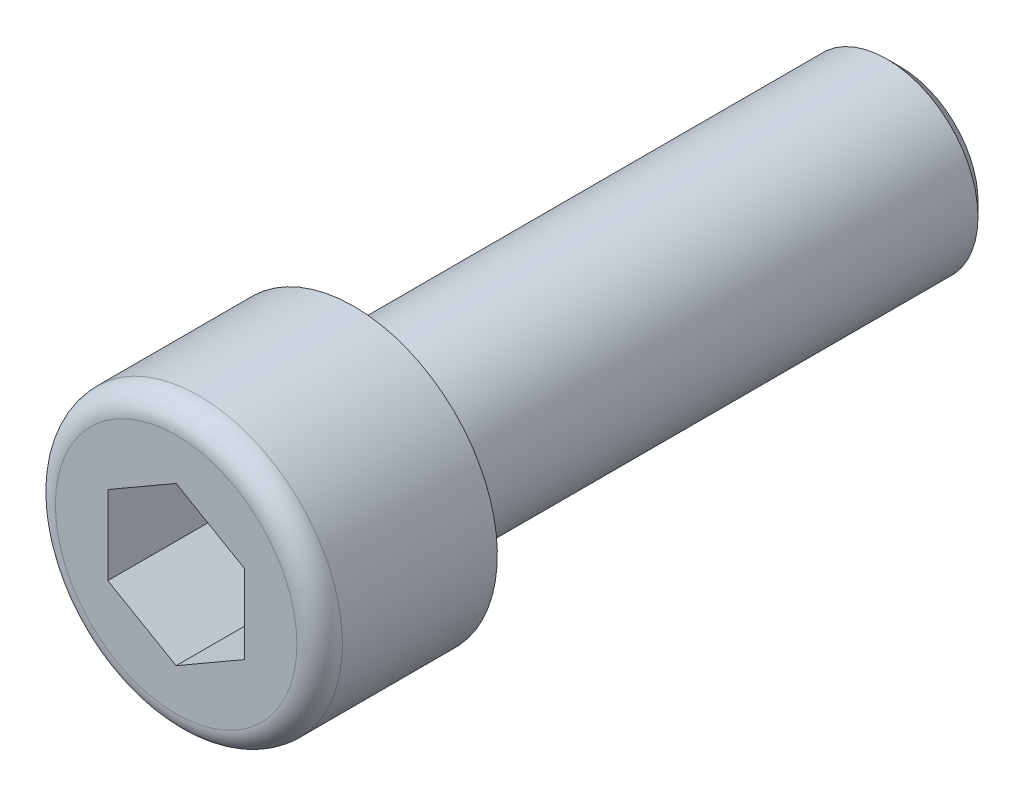
ISO-10303-21;
HEADER;
FILE_DESCRIPTION(('STEP AP214'),'2;1');
FILE_NAME('part.step','',(''),(''),'','','');
FILE_SCHEMA(('AUTOMOTIVE_DESIGN { 1 0 10303 214 1 1 1 1 }'));
ENDSEC;
DATA;
#1=APPLICATION_CONTEXT('core data for automotive mechanical design processes');
#2=APPLICATION_PROTOCOL_DEFINITION('international standard','automotive_design',2000,#1);
#3=PRODUCT_CONTEXT('',#1,'mechanical');
#4=PRODUCT('Part','Part','',(#3));
#5=PRODUCT_RELATED_PRODUCT_CATEGORY('part','',(#4));
#6=PRODUCT_DEFINITION_FORMATION('','',#4);
#7=PRODUCT_DEFINITION_CONTEXT('part definition',#1,'design');
#8=PRODUCT_DEFINITION('design','',#6,#7);
#9=PRODUCT_DEFINITION_SHAPE('','',#8);
#10=(LENGTH_UNIT() NAMED_UNIT(*) SI_UNIT(.MILLI.,.METRE.));
#11=(NAMED_UNIT(*) PLANE_ANGLE_UNIT() SI_UNIT($,.RADIAN.));
#12=(NAMED_UNIT(*) SI_UNIT($,.STERADIAN.) SOLID_ANGLE_UNIT());
#13=UNCERTAINTY_MEASURE_WITH_UNIT(LENGTH_MEASURE(1.E-05),#10,'distance_accuracy_value','');
#14=(GEOMETRIC_REPRESENTATION_CONTEXT(3) GLOBAL_UNCERTAINTY_ASSIGNED_CONTEXT((#13)) GLOBAL_UNIT_ASSIGNED_CONTEXT((#10,
#11,#12)) REPRESENTATION_CONTEXT('',''));
#15=CARTESIAN_POINT('',(0.,0.,0.));
#16=DIRECTION('',(0.,0.,1.));
#17=DIRECTION('',(1.,0.,0.));
#18=AXIS2_PLACEMENT_3D('',#15,#16,#17);
#19=CARTESIAN_POINT('',(0.,0.,7.95));
#20=DIRECTION('',(0.,0.,1.));
#21=DIRECTION('',(0.,-1.,0.));
#22=AXIS2_PLACEMENT_3D('',#19,#20,#21);
#23=PLANE('',#22);
#24=CARTESIAN_POINT('',(0.,0.,7.95));
#25=DIRECTION('',(0.,0.,1.));
#26=DIRECTION('',(0.,-1.,0.));
#27=AXIS2_PLACEMENT_3D('',#24,#25,#26);
#28=CIRCLE('',#27,2.65);
#29=CARTESIAN_POINT('',(0.,-2.65000000000001,7.95));
#30=VERTEX_POINT('',#29);
#31=EDGE_CURVE('E152',#30,#30,#28,.T.);
#32=ORIENTED_EDGE('',*,*,#31,.T.);
#33=EDGE_LOOP('',(#32));
#34=FACE_BOUND('',#33,.T.);
#35=DIRECTION('',(-0.866025403784438,0.5,0.));
#36=VECTOR('',#35,1.);
#37=CARTESIAN_POINT('',(1.5,0.866025403784439,7.95));
#38=LINE('',#37,#36);
#39=CARTESIAN_POINT('',(1.5,0.866025403784439,7.95));
#40=VERTEX_POINT('',#39);
#41=CARTESIAN_POINT('',(0.,1.73205080756888,7.95));
#42=VERTEX_POINT('',#41);
#43=EDGE_CURVE('E51',#40,#42,#38,.T.);
#44=ORIENTED_EDGE('',*,*,#43,.F.);
#45=DIRECTION('',(0.,1.,0.));
#46=VECTOR('',#45,1.);
#47=CARTESIAN_POINT('',(1.5,-0.866025403784439,7.95));
#48=LINE('',#47,#46);
#49=CARTESIAN_POINT('',(1.5,-0.866025403784439,7.95));
#50=VERTEX_POINT('',#49);
#51=EDGE_CURVE('E134',#50,#40,#48,.T.);
#52=ORIENTED_EDGE('',*,*,#51,.F.);
#53=DIRECTION('',(0.866025403784439,0.5,0.));
#54=VECTOR('',#53,1.);
#55=CARTESIAN_POINT('',(0.,-1.73205080756888,7.95));
#56=LINE('',#55,#54);
#57=CARTESIAN_POINT('',(0.,-1.73205080756888,7.95));
#58=VERTEX_POINT('',#57);
#59=EDGE_CURVE('E132',#58,#50,#56,.T.);
#60=ORIENTED_EDGE('',*,*,#59,.F.);
#61=DIRECTION('',(0.866025403784439,-0.5,0.));
#62=VECTOR('',#61,1.);
#63=CARTESIAN_POINT('',(-1.5,-0.866025403784439,7.95));
#64=LINE('',#63,#62);
#65=CARTESIAN_POINT('',(-1.5,-0.866025403784439,7.95));
#66=VERTEX_POINT('',#65);
#67=EDGE_CURVE('E99',#66,#58,#64,.T.);
#68=ORIENTED_EDGE('',*,*,#67,.F.);
#69=DIRECTION('',(0.,-1.,0.));
#70=VECTOR('',#69,1.);
#71=CARTESIAN_POINT('',(-1.5,0.866025403784439,7.95));
#72=LINE('',#71,#70);
#73=CARTESIAN_POINT('',(-1.5,0.866025403784439,7.95));
#74=VERTEX_POINT('',#73);
#75=EDGE_CURVE('E128',#74,#66,#72,.T.);
#76=ORIENTED_EDGE('',*,*,#75,.F.);
#77=DIRECTION('',(-0.866025403784439,-0.5,0.));
#78=VECTOR('',#77,1.);
#79=CARTESIAN_POINT('',(0.,1.73205080756888,7.95));
#80=LINE('',#79,#78);
#81=EDGE_CURVE('E125',#42,#74,#80,.T.);
#82=ORIENTED_EDGE('',*,*,#81,.F.);
#83=EDGE_LOOP('',(#44,#52,#60,#68,#76,#82));
#84=FACE_BOUND('',#83,.T.);
#85=ADVANCED_FACE('F35',(#34,#84),#23,.T.);
#86=CARTESIAN_POINT('',(0.,0.,-7.95));
#87=DIRECTION('',(0.,0.,-1.));
#88=DIRECTION('',(0.,1.,0.));
#89=AXIS2_PLACEMENT_3D('',#86,#87,#88);
#90=CYLINDRICAL_SURFACE('',#89,3.15);
#91=CARTESIAN_POINT('',(0.,0.,7.45));
#92=DIRECTION('',(0.,0.,1.));
#93=DIRECTION('',(0.,-1.,0.));
#94=AXIS2_PLACEMENT_3D('',#91,#92,#93);
#95=CIRCLE('',#94,3.15);
#96=CARTESIAN_POINT('',(0.,-3.15000000000001,7.45));
#97=VERTEX_POINT('',#96);
#98=EDGE_CURVE('E149',#97,#97,#95,.F.);
#99=ORIENTED_EDGE('',*,*,#98,.T.);
#100=EDGE_LOOP('',(#99));
#101=FACE_BOUND('',#100,.T.);
#102=CARTESIAN_POINT('',(0.,0.,4.05));
#103=DIRECTION('',(0.,0.,-1.));
#104=DIRECTION('',(0.,1.,0.));
#105=AXIS2_PLACEMENT_3D('',#102,#103,#104);
#106=CIRCLE('',#105,3.15);
#107=CARTESIAN_POINT('',(0.,3.15,4.05));
#108=VERTEX_POINT('',#107);
#109=EDGE_CURVE('E146',#108,#108,#106,.T.);
#110=ORIENTED_EDGE('',*,*,#109,.F.);
#111=EDGE_LOOP('',(#110));
#112=FACE_BOUND('',#111,.T.);
#113=ADVANCED_FACE('F168',(#101,#112),#90,.T.);
#114=CARTESIAN_POINT('',(0.,3.15,4.05));
#115=DIRECTION('',(0.,0.,-1.));
#116=DIRECTION('',(0.,1.,0.));
#117=AXIS2_PLACEMENT_3D('',#114,#115,#116);
#118=PLANE('',#117);
#119=ORIENTED_EDGE('',*,*,#109,.T.);
#120=EDGE_LOOP('',(#119));
#121=FACE_BOUND('',#120,.T.);
#122=CARTESIAN_POINT('',(0.,0.,4.05));
#123=DIRECTION('',(0.,0.,-1.));
#124=DIRECTION('',(0.,1.,0.));
#125=AXIS2_PLACEMENT_3D('',#122,#123,#124);
#126=CIRCLE('',#125,2.);
#127=CARTESIAN_POINT('',(0.,2.,4.05));
#128=VERTEX_POINT('',#127);
#129=EDGE_CURVE('E138',#128,#128,#126,.T.);
#130=ORIENTED_EDGE('',*,*,#129,.F.);
#131=EDGE_LOOP('',(#130));
#132=FACE_BOUND('',#131,.T.);
#133=ADVANCED_FACE('F174',(#121,#132),#118,.T.);
#134=CARTESIAN_POINT('',(0.,0.,-7.95));
#135=DIRECTION('',(0.,0.,-1.));
#136=DIRECTION('',(0.,1.,0.));
#137=AXIS2_PLACEMENT_3D('',#134,#135,#136);
#138=CYLINDRICAL_SURFACE('',#137,2.);
#139=CARTESIAN_POINT('',(0.,0.,-7.65));
#140=DIRECTION('',(0.,0.,-1.));
#141=DIRECTION('',(0.,1.,0.));
#142=AXIS2_PLACEMENT_3D('',#139,#140,#141);
#143=CIRCLE('',#142,2.);
#144=CARTESIAN_POINT('',(0.,2.,-7.65));
#145=VERTEX_POINT('',#144);
#146=EDGE_CURVE('E11',#145,#145,#143,.F.);
#147=ORIENTED_EDGE('',*,*,#146,.T.);
#148=EDGE_LOOP('',(#147));
#149=FACE_BOUND('',#148,.T.);
#150=ORIENTED_EDGE('',*,*,#129,.T.);
#151=EDGE_LOOP('',(#150));
#152=FACE_BOUND('',#151,.T.);
#153=ADVANCED_FACE('F181',(#149,#152),#138,.T.);
#154=CARTESIAN_POINT('',(0.,2.,-7.95));
#155=DIRECTION('',(0.,0.,-1.));
#156=DIRECTION('',(0.,1.,0.));
#157=AXIS2_PLACEMENT_3D('',#154,#155,#156);
#158=PLANE('',#157);
#159=CARTESIAN_POINT('',(0.,0.,-7.95));
#160=DIRECTION('',(0.,0.,-1.));
#161=DIRECTION('',(0.,1.,0.));
#162=AXIS2_PLACEMENT_3D('',#159,#160,#161);
#163=CIRCLE('',#162,1.7);
#164=CARTESIAN_POINT('',(0.,1.7,-7.95));
#165=VERTEX_POINT('',#164);
#166=EDGE_CURVE('E44',#165,#165,#163,.T.);
#167=ORIENTED_EDGE('',*,*,#166,.T.);
#168=EDGE_LOOP('',(#167));
#169=FACE_BOUND('',#168,.T.);
#170=ADVANCED_FACE('F157',(#169),#158,.T.);
#171=CARTESIAN_POINT('',(1.5,0.866025403784439,5.45));
#172=DIRECTION('',(0.5,0.866025403784439,0.));
#173=DIRECTION('',(-0.866025403784439,0.5,0.));
#174=AXIS2_PLACEMENT_3D('',#171,#172,#173);
#175=PLANE('',#174);
#176=ORIENTED_EDGE('',*,*,#43,.T.);
#177=DIRECTION('',(0.,0.,1.));
#178=VECTOR('',#177,1.);
#179=CARTESIAN_POINT('',(0.,1.73205080756888,5.45));
#180=LINE('',#179,#178);
#181=CARTESIAN_POINT('',(0.,1.73205080756888,5.45));
#182=VERTEX_POINT('',#181);
#183=EDGE_CURVE('E81',#182,#42,#180,.T.);
#184=ORIENTED_EDGE('',*,*,#183,.F.);
#185=DIRECTION('',(-0.866025403784438,0.5,0.));
#186=VECTOR('',#185,1.);
#187=CARTESIAN_POINT('',(1.5,0.866025403784439,5.45));
#188=LINE('',#187,#186);
#189=CARTESIAN_POINT('',(1.5,0.866025403784439,5.45));
#190=VERTEX_POINT('',#189);
#191=EDGE_CURVE('E136',#190,#182,#188,.T.);
#192=ORIENTED_EDGE('',*,*,#191,.F.);
#193=DIRECTION('',(0.,0.,1.));
#194=VECTOR('',#193,1.);
#195=CARTESIAN_POINT('',(1.5,0.866025403784439,5.45));
#196=LINE('',#195,#194);
#197=EDGE_CURVE('E59',#190,#40,#196,.T.);
#198=ORIENTED_EDGE('',*,*,#197,.T.);
#199=EDGE_LOOP('',(#176,#184,#192,#198));
#200=FACE_BOUND('',#199,.T.);
#201=ADVANCED_FACE('F188',(#200),#175,.F.);
#202=CARTESIAN_POINT('',(1.5,-0.866025403784439,5.45));
#203=DIRECTION('',(1.,0.,0.));
#204=DIRECTION('',(0.,0.,-1.));
#205=AXIS2_PLACEMENT_3D('',#202,#203,#204);
#206=PLANE('',#205);
#207=ORIENTED_EDGE('',*,*,#51,.T.);
#208=ORIENTED_EDGE('',*,*,#197,.F.);
#209=DIRECTION('',(0.,1.,0.));
#210=VECTOR('',#209,1.);
#211=CARTESIAN_POINT('',(1.5,-0.866025403784439,5.45));
#212=LINE('',#211,#210);
#213=CARTESIAN_POINT('',(1.5,-0.866025403784439,5.45));
#214=VERTEX_POINT('',#213);
#215=EDGE_CURVE('E111',#214,#190,#212,.T.);
#216=ORIENTED_EDGE('',*,*,#215,.F.);
#217=DIRECTION('',(0.,0.,1.));
#218=VECTOR('',#217,1.);
#219=CARTESIAN_POINT('',(1.5,-0.866025403784439,5.45));
#220=LINE('',#219,#218);
#221=EDGE_CURVE('E103',#214,#50,#220,.T.);
#222=ORIENTED_EDGE('',*,*,#221,.T.);
#223=EDGE_LOOP('',(#207,#208,#216,#222));
#224=FACE_BOUND('',#223,.T.);
#225=ADVANCED_FACE('F191',(#224),#206,.F.);
#226=CARTESIAN_POINT('',(0.,-1.73205080756888,5.45));
#227=DIRECTION('',(0.5,-0.866025403784439,0.));
#228=DIRECTION('',(0.866025403784439,0.5,0.));
#229=AXIS2_PLACEMENT_3D('',#226,#227,#228);
#230=PLANE('',#229);
#231=ORIENTED_EDGE('',*,*,#59,.T.);
#232=ORIENTED_EDGE('',*,*,#221,.F.);
#233=DIRECTION('',(0.866025403784439,0.5,0.));
#234=VECTOR('',#233,1.);
#235=CARTESIAN_POINT('',(0.,-1.73205080756888,5.45));
#236=LINE('',#235,#234);
#237=CARTESIAN_POINT('',(0.,-1.73205080756888,5.45));
#238=VERTEX_POINT('',#237);
#239=EDGE_CURVE('E107',#238,#214,#236,.T.);
#240=ORIENTED_EDGE('',*,*,#239,.F.);
#241=DIRECTION('',(0.,0.,1.));
#242=VECTOR('',#241,1.);
#243=CARTESIAN_POINT('',(0.,-1.73205080756888,5.45));
#244=LINE('',#243,#242);
#245=EDGE_CURVE('E92',#238,#58,#244,.T.);
#246=ORIENTED_EDGE('',*,*,#245,.T.);
#247=EDGE_LOOP('',(#231,#232,#240,#246));
#248=FACE_BOUND('',#247,.T.);
#249=ADVANCED_FACE('F108',(#248),#230,.F.);
#250=CARTESIAN_POINT('',(-1.5,-0.866025403784439,5.45));
#251=DIRECTION('',(-0.5,-0.866025403784439,0.));
#252=DIRECTION('',(0.866025403784439,-0.5,0.));
#253=AXIS2_PLACEMENT_3D('',#250,#251,#252);
#254=PLANE('',#253);
#255=ORIENTED_EDGE('',*,*,#67,.T.);
#256=ORIENTED_EDGE('',*,*,#245,.F.);
#257=DIRECTION('',(0.866025403784439,-0.5,0.));
#258=VECTOR('',#257,1.);
#259=CARTESIAN_POINT('',(-1.5,-0.866025403784439,5.45));
#260=LINE('',#259,#258);
#261=CARTESIAN_POINT('',(-1.5,-0.866025403784439,5.45));
#262=VERTEX_POINT('',#261);
#263=EDGE_CURVE('E96',#262,#238,#260,.T.);
#264=ORIENTED_EDGE('',*,*,#263,.F.);
#265=DIRECTION('',(0.,0.,1.));
#266=VECTOR('',#265,1.);
#267=CARTESIAN_POINT('',(-1.5,-0.866025403784439,5.45));
#268=LINE('',#267,#266);
#269=EDGE_CURVE('E104',#262,#66,#268,.T.);
#270=ORIENTED_EDGE('',*,*,#269,.T.);
#271=EDGE_LOOP('',(#255,#256,#264,#270));
#272=FACE_BOUND('',#271,.T.);
#273=ADVANCED_FACE('F94',(#272),#254,.F.);
#274=CARTESIAN_POINT('',(-1.5,0.866025403784439,5.45));
#275=DIRECTION('',(-1.,0.,0.));
#276=DIRECTION('',(0.,0.,1.));
#277=AXIS2_PLACEMENT_3D('',#274,#275,#276);
#278=PLANE('',#277);
#279=ORIENTED_EDGE('',*,*,#75,.T.);
#280=ORIENTED_EDGE('',*,*,#269,.F.);
#281=DIRECTION('',(0.,-1.,0.));
#282=VECTOR('',#281,1.);
#283=CARTESIAN_POINT('',(-1.5,0.866025403784439,5.45));
#284=LINE('',#283,#282);
#285=CARTESIAN_POINT('',(-1.5,0.866025403784439,5.45));
#286=VERTEX_POINT('',#285);
#287=EDGE_CURVE('E117',#286,#262,#284,.T.);
#288=ORIENTED_EDGE('',*,*,#287,.F.);
#289=DIRECTION('',(0.,0.,1.));
#290=VECTOR('',#289,1.);
#291=CARTESIAN_POINT('',(-1.5,0.866025403784439,5.45));
#292=LINE('',#291,#290);
#293=EDGE_CURVE('E141',#286,#74,#292,.T.);
#294=ORIENTED_EDGE('',*,*,#293,.T.);
#295=EDGE_LOOP('',(#279,#280,#288,#294));
#296=FACE_BOUND('',#295,.T.);
#297=ADVANCED_FACE('F195',(#296),#278,.F.);
#298=CARTESIAN_POINT('',(0.,1.73205080756888,5.45));
#299=DIRECTION('',(-0.5,0.866025403784439,0.));
#300=DIRECTION('',(-0.866025403784439,-0.5,0.));
#301=AXIS2_PLACEMENT_3D('',#298,#299,#300);
#302=PLANE('',#301);
#303=ORIENTED_EDGE('',*,*,#81,.T.);
#304=ORIENTED_EDGE('',*,*,#293,.F.);
#305=DIRECTION('',(-0.866025403784439,-0.5,0.));
#306=VECTOR('',#305,1.);
#307=CARTESIAN_POINT('',(0.,1.73205080756888,5.45));
#308=LINE('',#307,#306);
#309=EDGE_CURVE('E119',#182,#286,#308,.T.);
#310=ORIENTED_EDGE('',*,*,#309,.F.);
#311=ORIENTED_EDGE('',*,*,#183,.T.);
#312=EDGE_LOOP('',(#303,#304,#310,#311));
#313=FACE_BOUND('',#312,.T.);
#314=ADVANCED_FACE('F192',(#313),#302,.F.);
#315=CARTESIAN_POINT('',(0.,0.,5.45));
#316=DIRECTION('',(0.,0.,1.));
#317=DIRECTION('',(1.,0.,0.));
#318=AXIS2_PLACEMENT_3D('',#315,#316,#317);
#319=PLANE('',#318);
#320=ORIENTED_EDGE('',*,*,#191,.T.);
#321=ORIENTED_EDGE('',*,*,#309,.T.);
#322=ORIENTED_EDGE('',*,*,#287,.T.);
#323=ORIENTED_EDGE('',*,*,#263,.T.);
#324=ORIENTED_EDGE('',*,*,#239,.T.);
#325=ORIENTED_EDGE('',*,*,#215,.T.);
#326=EDGE_LOOP('',(#320,#321,#322,#323,#324,#325));
#327=FACE_BOUND('',#326,.T.);
#328=ADVANCED_FACE('F114',(#327),#319,.T.);
#329=CARTESIAN_POINT('',(0.,0.,7.45));
#330=DIRECTION('',(0.,0.,1.));
#331=DIRECTION('',(0.,-1.,0.));
#332=AXIS2_PLACEMENT_3D('',#329,#330,#331);
#333=TOROIDAL_SURFACE('',#332,2.65,0.5);
#334=ORIENTED_EDGE('',*,*,#31,.F.);
#335=EDGE_LOOP('',(#334));
#336=FACE_BOUND('',#335,.T.);
#337=ORIENTED_EDGE('',*,*,#98,.F.);
#338=EDGE_LOOP('',(#337));
#339=FACE_BOUND('',#338,.T.);
#340=ADVANCED_FACE('F160',(#336,#339),#333,.T.);
#341=CARTESIAN_POINT('',(0.,0.,-7.95));
#342=DIRECTION('',(0.,0.,1.));
#343=DIRECTION('',(0.,-1.,0.));
#344=AXIS2_PLACEMENT_3D('',#341,#342,#343);
#345=CONICAL_SURFACE('',#344,1.7,0.785398163397447);
#346=ORIENTED_EDGE('',*,*,#146,.F.);
#347=EDGE_LOOP('',(#346));
#348=FACE_BOUND('',#347,.T.);
#349=ORIENTED_EDGE('',*,*,#166,.F.);
#350=EDGE_LOOP('',(#349));
#351=FACE_BOUND('',#350,.T.);
#352=ADVANCED_FACE('F38',(#348,#351),#345,.T.);
#353=CLOSED_SHELL('',(#85,#113,#133,#153,#170,#201,#225,#249,#273,#297,#314,#328,#340,#352));
#354=MANIFOLD_SOLID_BREP('B2',#353);
#355=ADVANCED_BREP_SHAPE_REPRESENTATION('',(#18,#354),#14);
#356=SHAPE_DEFINITION_REPRESENTATION(#9,#355);
ENDSEC;
END-ISO-10303-21;
